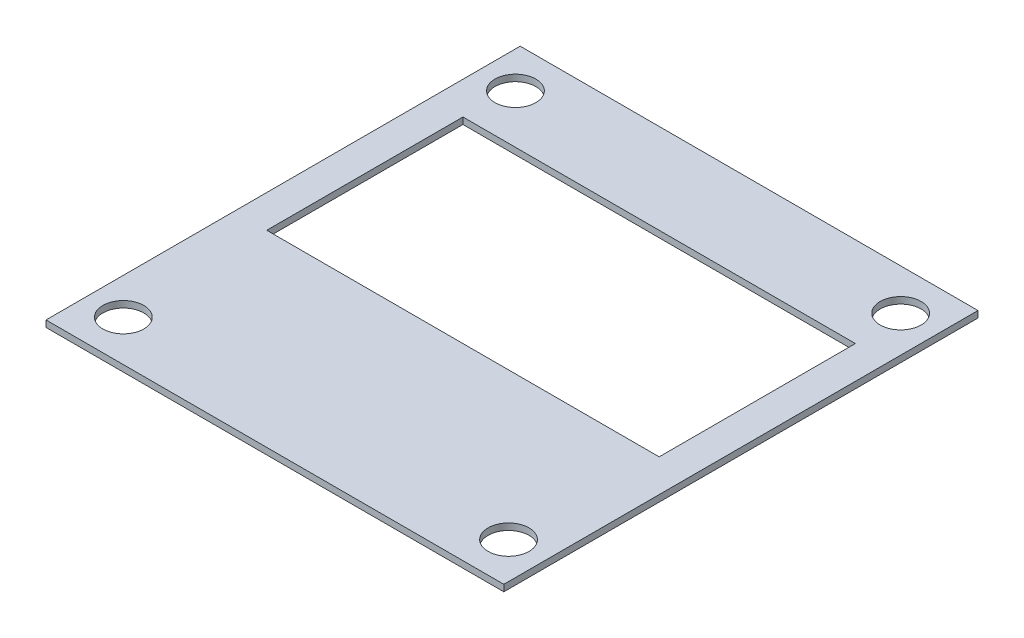
ISO-10303-21;
HEADER;
FILE_DESCRIPTION(('STEP AP214'),'2;1');
FILE_NAME('part.step','',(''),(''),'','','');
FILE_SCHEMA(('AUTOMOTIVE_DESIGN { 1 0 10303 214 1 1 1 1 }'));
ENDSEC;
DATA;
#1=APPLICATION_CONTEXT('core data for automotive mechanical design processes');
#2=APPLICATION_PROTOCOL_DEFINITION('international standard','automotive_design',2000,#1);
#3=PRODUCT_CONTEXT('',#1,'mechanical');
#4=PRODUCT('Part','Part','',(#3));
#5=PRODUCT_RELATED_PRODUCT_CATEGORY('part','',(#4));
#6=PRODUCT_DEFINITION_FORMATION('','',#4);
#7=PRODUCT_DEFINITION_CONTEXT('part definition',#1,'design');
#8=PRODUCT_DEFINITION('design','',#6,#7);
#9=PRODUCT_DEFINITION_SHAPE('','',#8);
#10=(LENGTH_UNIT() NAMED_UNIT(*) SI_UNIT(.MILLI.,.METRE.));
#11=(NAMED_UNIT(*) PLANE_ANGLE_UNIT() SI_UNIT($,.RADIAN.));
#12=(NAMED_UNIT(*) SI_UNIT($,.STERADIAN.) SOLID_ANGLE_UNIT());
#13=UNCERTAINTY_MEASURE_WITH_UNIT(LENGTH_MEASURE(1.E-05),#10,'distance_accuracy_value','');
#14=(GEOMETRIC_REPRESENTATION_CONTEXT(3) GLOBAL_UNCERTAINTY_ASSIGNED_CONTEXT((#13)) GLOBAL_UNIT_ASSIGNED_CONTEXT((#10,
#11,#12)) REPRESENTATION_CONTEXT('',''));
#15=CARTESIAN_POINT('',(0.,0.,0.));
#16=DIRECTION('',(0.,0.,1.));
#17=DIRECTION('',(1.,0.,0.));
#18=AXIS2_PLACEMENT_3D('',#15,#16,#17);
#19=CARTESIAN_POINT('',(0.,0.4,0.));
#20=DIRECTION('',(0.,1.,0.));
#21=DIRECTION('',(0.,0.,1.));
#22=AXIS2_PLACEMENT_3D('',#19,#20,#21);
#23=PLANE('',#22);
#24=CARTESIAN_POINT('',(11.78,0.399999999999999,11.99));
#25=DIRECTION('',(0.,1.,0.));
#26=DIRECTION('',(0.,0.,1.));
#27=AXIS2_PLACEMENT_3D('',#24,#25,#26);
#28=CIRCLE('',#27,1.25);
#29=CARTESIAN_POINT('',(11.78,0.399999999999999,13.24));
#30=VERTEX_POINT('',#29);
#31=EDGE_CURVE('E143',#30,#30,#28,.T.);
#32=ORIENTED_EDGE('',*,*,#31,.F.);
#33=EDGE_LOOP('',(#32));
#34=FACE_BOUND('',#33,.T.);
#35=CARTESIAN_POINT('',(-11.78,0.399999999999999,11.99));
#36=DIRECTION('',(0.,1.,0.));
#37=DIRECTION('',(0.,0.,1.));
#38=AXIS2_PLACEMENT_3D('',#35,#36,#37);
#39=CIRCLE('',#38,1.25);
#40=CARTESIAN_POINT('',(-11.78,0.399999999999999,13.24));
#41=VERTEX_POINT('',#40);
#42=EDGE_CURVE('E296',#41,#41,#39,.T.);
#43=ORIENTED_EDGE('',*,*,#42,.F.);
#44=EDGE_LOOP('',(#43));
#45=FACE_BOUND('',#44,.T.);
#46=CARTESIAN_POINT('',(-11.78,0.399999999999999,-11.99));
#47=DIRECTION('',(0.,1.,0.));
#48=DIRECTION('',(0.,0.,1.));
#49=AXIS2_PLACEMENT_3D('',#46,#47,#48);
#50=CIRCLE('',#49,1.25);
#51=CARTESIAN_POINT('',(-11.78,0.399999999999999,-10.74));
#52=VERTEX_POINT('',#51);
#53=EDGE_CURVE('E270',#52,#52,#50,.T.);
#54=ORIENTED_EDGE('',*,*,#53,.F.);
#55=EDGE_LOOP('',(#54));
#56=FACE_BOUND('',#55,.T.);
#57=CARTESIAN_POINT('',(11.78,0.399999999999999,-11.99));
#58=DIRECTION('',(0.,1.,0.));
#59=DIRECTION('',(0.,0.,1.));
#60=AXIS2_PLACEMENT_3D('',#57,#58,#59);
#61=CIRCLE('',#60,1.25);
#62=CARTESIAN_POINT('',(11.78,0.399999999999999,-10.74));
#63=VERTEX_POINT('',#62);
#64=EDGE_CURVE('E282',#63,#63,#61,.T.);
#65=ORIENTED_EDGE('',*,*,#64,.F.);
#66=EDGE_LOOP('',(#65));
#67=FACE_BOUND('',#66,.T.);
#68=DIRECTION('',(0.,0.,-1.));
#69=VECTOR('',#68,1.);
#70=CARTESIAN_POINT('',(14.,0.4,-14.5));
#71=LINE('',#70,#69);
#72=CARTESIAN_POINT('',(14.,0.4,14.5));
#73=VERTEX_POINT('',#72);
#74=CARTESIAN_POINT('',(14.,0.4,-14.5));
#75=VERTEX_POINT('',#74);
#76=EDGE_CURVE('E159',#73,#75,#71,.T.);
#77=ORIENTED_EDGE('',*,*,#76,.T.);
#78=DIRECTION('',(-1.,0.,0.));
#79=VECTOR('',#78,1.);
#80=CARTESIAN_POINT('',(-14.,0.4,-14.5));
#81=LINE('',#80,#79);
#82=CARTESIAN_POINT('',(-14.,0.4,-14.5));
#83=VERTEX_POINT('',#82);
#84=EDGE_CURVE('E163',#75,#83,#81,.T.);
#85=ORIENTED_EDGE('',*,*,#84,.T.);
#86=DIRECTION('',(0.,0.,1.));
#87=VECTOR('',#86,1.);
#88=CARTESIAN_POINT('',(-14.,0.4,-14.5));
#89=LINE('',#88,#87);
#90=CARTESIAN_POINT('',(-14.,0.4,14.5));
#91=VERTEX_POINT('',#90);
#92=EDGE_CURVE('E167',#83,#91,#89,.T.);
#93=ORIENTED_EDGE('',*,*,#92,.T.);
#94=DIRECTION('',(1.,0.,0.));
#95=VECTOR('',#94,1.);
#96=CARTESIAN_POINT('',(-14.,0.4,14.5));
#97=LINE('',#96,#95);
#98=EDGE_CURVE('E170',#91,#73,#97,.T.);
#99=ORIENTED_EDGE('',*,*,#98,.T.);
#100=EDGE_LOOP('',(#77,#85,#93,#99));
#101=FACE_BOUND('',#100,.T.);
#102=DIRECTION('',(-1.,0.,0.));
#103=VECTOR('',#102,1.);
#104=CARTESIAN_POINT('',(-12.,0.4,-9.));
#105=LINE('',#104,#103);
#106=CARTESIAN_POINT('',(12.,0.4,-9.));
#107=VERTEX_POINT('',#106);
#108=CARTESIAN_POINT('',(-12.,0.4,-9.));
#109=VERTEX_POINT('',#108);
#110=EDGE_CURVE('E118',#107,#109,#105,.T.);
#111=ORIENTED_EDGE('',*,*,#110,.F.);
#112=DIRECTION('',(0.,0.,-1.));
#113=VECTOR('',#112,1.);
#114=CARTESIAN_POINT('',(12.,0.4,-9.));
#115=LINE('',#114,#113);
#116=CARTESIAN_POINT('',(12.,0.4,3.));
#117=VERTEX_POINT('',#116);
#118=EDGE_CURVE('E109',#117,#107,#115,.T.);
#119=ORIENTED_EDGE('',*,*,#118,.F.);
#120=DIRECTION('',(1.,0.,0.));
#121=VECTOR('',#120,1.);
#122=CARTESIAN_POINT('',(-12.,0.4,3.));
#123=LINE('',#122,#121);
#124=CARTESIAN_POINT('',(-12.,0.4,3.));
#125=VERTEX_POINT('',#124);
#126=EDGE_CURVE('E135',#125,#117,#123,.T.);
#127=ORIENTED_EDGE('',*,*,#126,.F.);
#128=DIRECTION('',(0.,0.,1.));
#129=VECTOR('',#128,1.);
#130=CARTESIAN_POINT('',(-12.,0.4,-9.));
#131=LINE('',#130,#129);
#132=EDGE_CURVE('E131',#109,#125,#131,.T.);
#133=ORIENTED_EDGE('',*,*,#132,.F.);
#134=EDGE_LOOP('',(#111,#119,#127,#133));
#135=FACE_BOUND('',#134,.T.);
#136=ADVANCED_FACE('F43',(#34,#45,#56,#67,#101,#135),#23,.T.);
#137=CARTESIAN_POINT('',(0.,0.,0.));
#138=DIRECTION('',(0.,1.,0.));
#139=DIRECTION('',(0.,0.,1.));
#140=AXIS2_PLACEMENT_3D('',#137,#138,#139);
#141=PLANE('',#140);
#142=CARTESIAN_POINT('',(11.78,0.,11.99));
#143=DIRECTION('',(0.,-1.,0.));
#144=DIRECTION('',(0.,0.,-1.));
#145=AXIS2_PLACEMENT_3D('',#142,#143,#144);
#146=CIRCLE('',#145,1.25);
#147=CARTESIAN_POINT('',(11.78,0.,10.74));
#148=VERTEX_POINT('',#147);
#149=EDGE_CURVE('E285',#148,#148,#146,.T.);
#150=ORIENTED_EDGE('',*,*,#149,.F.);
#151=EDGE_LOOP('',(#150));
#152=FACE_BOUND('',#151,.T.);
#153=CARTESIAN_POINT('',(-11.78,0.,11.99));
#154=DIRECTION('',(0.,-1.,0.));
#155=DIRECTION('',(0.,0.,-1.));
#156=AXIS2_PLACEMENT_3D('',#153,#154,#155);
#157=CIRCLE('',#156,1.25);
#158=CARTESIAN_POINT('',(-11.78,0.,10.74));
#159=VERTEX_POINT('',#158);
#160=EDGE_CURVE('E277',#159,#159,#157,.T.);
#161=ORIENTED_EDGE('',*,*,#160,.F.);
#162=EDGE_LOOP('',(#161));
#163=FACE_BOUND('',#162,.T.);
#164=CARTESIAN_POINT('',(-11.78,0.,-11.99));
#165=DIRECTION('',(0.,-1.,0.));
#166=DIRECTION('',(0.,0.,-1.));
#167=AXIS2_PLACEMENT_3D('',#164,#165,#166);
#168=CIRCLE('',#167,1.25);
#169=CARTESIAN_POINT('',(-11.78,0.,-13.24));
#170=VERTEX_POINT('',#169);
#171=EDGE_CURVE('E273',#170,#170,#168,.T.);
#172=ORIENTED_EDGE('',*,*,#171,.F.);
#173=EDGE_LOOP('',(#172));
#174=FACE_BOUND('',#173,.T.);
#175=CARTESIAN_POINT('',(11.78,0.,-11.99));
#176=DIRECTION('',(0.,-1.,0.));
#177=DIRECTION('',(0.,0.,-1.));
#178=AXIS2_PLACEMENT_3D('',#175,#176,#177);
#179=CIRCLE('',#178,1.25);
#180=CARTESIAN_POINT('',(11.78,0.,-13.24));
#181=VERTEX_POINT('',#180);
#182=EDGE_CURVE('E276',#181,#181,#179,.T.);
#183=ORIENTED_EDGE('',*,*,#182,.F.);
#184=EDGE_LOOP('',(#183));
#185=FACE_BOUND('',#184,.T.);
#186=DIRECTION('',(0.,0.,-1.));
#187=VECTOR('',#186,1.);
#188=CARTESIAN_POINT('',(14.,0.,-14.5));
#189=LINE('',#188,#187);
#190=CARTESIAN_POINT('',(14.,0.,14.5));
#191=VERTEX_POINT('',#190);
#192=CARTESIAN_POINT('',(14.,0.,-14.5));
#193=VERTEX_POINT('',#192);
#194=EDGE_CURVE('E127',#191,#193,#189,.T.);
#195=ORIENTED_EDGE('',*,*,#194,.F.);
#196=DIRECTION('',(1.,0.,0.));
#197=VECTOR('',#196,1.);
#198=CARTESIAN_POINT('',(-14.,0.,14.5));
#199=LINE('',#198,#197);
#200=CARTESIAN_POINT('',(-14.,0.,14.5));
#201=VERTEX_POINT('',#200);
#202=EDGE_CURVE('E164',#201,#191,#199,.T.);
#203=ORIENTED_EDGE('',*,*,#202,.F.);
#204=DIRECTION('',(0.,0.,1.));
#205=VECTOR('',#204,1.);
#206=CARTESIAN_POINT('',(-14.,0.,-14.5));
#207=LINE('',#206,#205);
#208=CARTESIAN_POINT('',(-14.,0.,-14.5));
#209=VERTEX_POINT('',#208);
#210=EDGE_CURVE('E180',#209,#201,#207,.T.);
#211=ORIENTED_EDGE('',*,*,#210,.F.);
#212=DIRECTION('',(-1.,0.,0.));
#213=VECTOR('',#212,1.);
#214=CARTESIAN_POINT('',(-14.,0.,-14.5));
#215=LINE('',#214,#213);
#216=EDGE_CURVE('E177',#193,#209,#215,.T.);
#217=ORIENTED_EDGE('',*,*,#216,.F.);
#218=EDGE_LOOP('',(#195,#203,#211,#217));
#219=FACE_BOUND('',#218,.T.);
#220=DIRECTION('',(0.,0.,-1.));
#221=VECTOR('',#220,1.);
#222=CARTESIAN_POINT('',(12.,0.,-9.));
#223=LINE('',#222,#221);
#224=CARTESIAN_POINT('',(12.,0.,3.));
#225=VERTEX_POINT('',#224);
#226=CARTESIAN_POINT('',(12.,0.,-9.));
#227=VERTEX_POINT('',#226);
#228=EDGE_CURVE('E67',#225,#227,#223,.T.);
#229=ORIENTED_EDGE('',*,*,#228,.T.);
#230=DIRECTION('',(-1.,0.,0.));
#231=VECTOR('',#230,1.);
#232=CARTESIAN_POINT('',(-12.,0.,-9.));
#233=LINE('',#232,#231);
#234=CARTESIAN_POINT('',(-12.,0.,-9.));
#235=VERTEX_POINT('',#234);
#236=EDGE_CURVE('E125',#227,#235,#233,.T.);
#237=ORIENTED_EDGE('',*,*,#236,.T.);
#238=DIRECTION('',(0.,0.,1.));
#239=VECTOR('',#238,1.);
#240=CARTESIAN_POINT('',(-12.,0.,-9.));
#241=LINE('',#240,#239);
#242=CARTESIAN_POINT('',(-12.,0.,3.));
#243=VERTEX_POINT('',#242);
#244=EDGE_CURVE('E146',#235,#243,#241,.T.);
#245=ORIENTED_EDGE('',*,*,#244,.T.);
#246=DIRECTION('',(1.,0.,0.));
#247=VECTOR('',#246,1.);
#248=CARTESIAN_POINT('',(-12.,0.,3.));
#249=LINE('',#248,#247);
#250=EDGE_CURVE('E119',#243,#225,#249,.T.);
#251=ORIENTED_EDGE('',*,*,#250,.T.);
#252=EDGE_LOOP('',(#229,#237,#245,#251));
#253=FACE_BOUND('',#252,.T.);
#254=ADVANCED_FACE('F203',(#152,#163,#174,#185,#219,#253),#141,.F.);
#255=CARTESIAN_POINT('',(14.,0.4,-14.5));
#256=DIRECTION('',(-1.,0.,0.));
#257=DIRECTION('',(0.,0.,1.));
#258=AXIS2_PLACEMENT_3D('',#255,#256,#257);
#259=PLANE('',#258);
#260=ORIENTED_EDGE('',*,*,#194,.T.);
#261=DIRECTION('',(0.,-1.,0.));
#262=VECTOR('',#261,1.);
#263=CARTESIAN_POINT('',(14.,0.4,-14.5));
#264=LINE('',#263,#262);
#265=EDGE_CURVE('E11',#75,#193,#264,.T.);
#266=ORIENTED_EDGE('',*,*,#265,.F.);
#267=ORIENTED_EDGE('',*,*,#76,.F.);
#268=DIRECTION('',(0.,-1.,0.));
#269=VECTOR('',#268,1.);
#270=CARTESIAN_POINT('',(14.,0.4,14.5));
#271=LINE('',#270,#269);
#272=EDGE_CURVE('E173',#73,#191,#271,.T.);
#273=ORIENTED_EDGE('',*,*,#272,.T.);
#274=EDGE_LOOP('',(#260,#266,#267,#273));
#275=FACE_BOUND('',#274,.T.);
#276=ADVANCED_FACE('F45',(#275),#259,.F.);
#277=CARTESIAN_POINT('',(-14.,0.4,-14.5));
#278=DIRECTION('',(0.,0.,1.));
#279=DIRECTION('',(1.,0.,0.));
#280=AXIS2_PLACEMENT_3D('',#277,#278,#279);
#281=PLANE('',#280);
#282=ORIENTED_EDGE('',*,*,#216,.T.);
#283=DIRECTION('',(0.,-1.,0.));
#284=VECTOR('',#283,1.);
#285=CARTESIAN_POINT('',(-14.,0.4,-14.5));
#286=LINE('',#285,#284);
#287=EDGE_CURVE('E52',#83,#209,#286,.T.);
#288=ORIENTED_EDGE('',*,*,#287,.F.);
#289=ORIENTED_EDGE('',*,*,#84,.F.);
#290=ORIENTED_EDGE('',*,*,#265,.T.);
#291=EDGE_LOOP('',(#282,#288,#289,#290));
#292=FACE_BOUND('',#291,.T.);
#293=ADVANCED_FACE('F213',(#292),#281,.F.);
#294=CARTESIAN_POINT('',(-14.,0.4,-14.5));
#295=DIRECTION('',(1.,0.,0.));
#296=DIRECTION('',(0.,0.,-1.));
#297=AXIS2_PLACEMENT_3D('',#294,#295,#296);
#298=PLANE('',#297);
#299=ORIENTED_EDGE('',*,*,#210,.T.);
#300=DIRECTION('',(0.,-1.,0.));
#301=VECTOR('',#300,1.);
#302=CARTESIAN_POINT('',(-14.,0.4,14.5));
#303=LINE('',#302,#301);
#304=EDGE_CURVE('E188',#91,#201,#303,.T.);
#305=ORIENTED_EDGE('',*,*,#304,.F.);
#306=ORIENTED_EDGE('',*,*,#92,.F.);
#307=ORIENTED_EDGE('',*,*,#287,.T.);
#308=EDGE_LOOP('',(#299,#305,#306,#307));
#309=FACE_BOUND('',#308,.T.);
#310=ADVANCED_FACE('F197',(#309),#298,.F.);
#311=CARTESIAN_POINT('',(-14.,0.4,14.5));
#312=DIRECTION('',(0.,0.,-1.));
#313=DIRECTION('',(-1.,0.,0.));
#314=AXIS2_PLACEMENT_3D('',#311,#312,#313);
#315=PLANE('',#314);
#316=ORIENTED_EDGE('',*,*,#202,.T.);
#317=ORIENTED_EDGE('',*,*,#272,.F.);
#318=ORIENTED_EDGE('',*,*,#98,.F.);
#319=ORIENTED_EDGE('',*,*,#304,.T.);
#320=EDGE_LOOP('',(#316,#317,#318,#319));
#321=FACE_BOUND('',#320,.T.);
#322=ADVANCED_FACE('F207',(#321),#315,.F.);
#323=CARTESIAN_POINT('',(12.,0.4,-9.));
#324=DIRECTION('',(-1.,0.,0.));
#325=DIRECTION('',(0.,0.,1.));
#326=AXIS2_PLACEMENT_3D('',#323,#324,#325);
#327=PLANE('',#326);
#328=ORIENTED_EDGE('',*,*,#228,.F.);
#329=DIRECTION('',(0.,-1.,0.));
#330=VECTOR('',#329,1.);
#331=CARTESIAN_POINT('',(12.,0.4,3.));
#332=LINE('',#331,#330);
#333=EDGE_CURVE('E113',#117,#225,#332,.T.);
#334=ORIENTED_EDGE('',*,*,#333,.F.);
#335=ORIENTED_EDGE('',*,*,#118,.T.);
#336=DIRECTION('',(0.,-1.,0.));
#337=VECTOR('',#336,1.);
#338=CARTESIAN_POINT('',(12.,0.4,-9.));
#339=LINE('',#338,#337);
#340=EDGE_CURVE('E112',#107,#227,#339,.T.);
#341=ORIENTED_EDGE('',*,*,#340,.T.);
#342=EDGE_LOOP('',(#328,#334,#335,#341));
#343=FACE_BOUND('',#342,.T.);
#344=ADVANCED_FACE('F111',(#343),#327,.T.);
#345=CARTESIAN_POINT('',(-12.,0.4,-9.));
#346=DIRECTION('',(0.,0.,1.));
#347=DIRECTION('',(1.,0.,0.));
#348=AXIS2_PLACEMENT_3D('',#345,#346,#347);
#349=PLANE('',#348);
#350=ORIENTED_EDGE('',*,*,#236,.F.);
#351=ORIENTED_EDGE('',*,*,#340,.F.);
#352=ORIENTED_EDGE('',*,*,#110,.T.);
#353=DIRECTION('',(0.,-1.,0.));
#354=VECTOR('',#353,1.);
#355=CARTESIAN_POINT('',(-12.,0.4,-9.));
#356=LINE('',#355,#354);
#357=EDGE_CURVE('E128',#109,#235,#356,.T.);
#358=ORIENTED_EDGE('',*,*,#357,.T.);
#359=EDGE_LOOP('',(#350,#351,#352,#358));
#360=FACE_BOUND('',#359,.T.);
#361=ADVANCED_FACE('F122',(#360),#349,.T.);
#362=CARTESIAN_POINT('',(-12.,0.4,-9.));
#363=DIRECTION('',(1.,0.,0.));
#364=DIRECTION('',(0.,0.,-1.));
#365=AXIS2_PLACEMENT_3D('',#362,#363,#364);
#366=PLANE('',#365);
#367=ORIENTED_EDGE('',*,*,#244,.F.);
#368=ORIENTED_EDGE('',*,*,#357,.F.);
#369=ORIENTED_EDGE('',*,*,#132,.T.);
#370=DIRECTION('',(0.,-1.,0.));
#371=VECTOR('',#370,1.);
#372=CARTESIAN_POINT('',(-12.,0.4,3.));
#373=LINE('',#372,#371);
#374=EDGE_CURVE('E59',#125,#243,#373,.T.);
#375=ORIENTED_EDGE('',*,*,#374,.T.);
#376=EDGE_LOOP('',(#367,#368,#369,#375));
#377=FACE_BOUND('',#376,.T.);
#378=ADVANCED_FACE('F240',(#377),#366,.T.);
#379=CARTESIAN_POINT('',(-12.,0.4,3.));
#380=DIRECTION('',(0.,0.,-1.));
#381=DIRECTION('',(-1.,0.,0.));
#382=AXIS2_PLACEMENT_3D('',#379,#380,#381);
#383=PLANE('',#382);
#384=ORIENTED_EDGE('',*,*,#250,.F.);
#385=ORIENTED_EDGE('',*,*,#374,.F.);
#386=ORIENTED_EDGE('',*,*,#126,.T.);
#387=ORIENTED_EDGE('',*,*,#333,.T.);
#388=EDGE_LOOP('',(#384,#385,#386,#387));
#389=FACE_BOUND('',#388,.T.);
#390=ADVANCED_FACE('F244',(#389),#383,.T.);
#391=CARTESIAN_POINT('',(11.78,10.,-11.99));
#392=DIRECTION('',(0.,-1.,0.));
#393=DIRECTION('',(0.,0.,-1.));
#394=AXIS2_PLACEMENT_3D('',#391,#392,#393);
#395=CYLINDRICAL_SURFACE('',#394,1.25);
#396=ORIENTED_EDGE('',*,*,#64,.T.);
#397=EDGE_LOOP('',(#396));
#398=FACE_BOUND('',#397,.T.);
#399=ORIENTED_EDGE('',*,*,#182,.T.);
#400=EDGE_LOOP('',(#399));
#401=FACE_BOUND('',#400,.T.);
#402=ADVANCED_FACE('F250',(#398,#401),#395,.F.);
#403=CARTESIAN_POINT('',(-11.78,10.,-11.99));
#404=DIRECTION('',(0.,-1.,0.));
#405=DIRECTION('',(0.,0.,-1.));
#406=AXIS2_PLACEMENT_3D('',#403,#404,#405);
#407=CYLINDRICAL_SURFACE('',#406,1.25);
#408=ORIENTED_EDGE('',*,*,#53,.T.);
#409=EDGE_LOOP('',(#408));
#410=FACE_BOUND('',#409,.T.);
#411=ORIENTED_EDGE('',*,*,#171,.T.);
#412=EDGE_LOOP('',(#411));
#413=FACE_BOUND('',#412,.T.);
#414=ADVANCED_FACE('F253',(#410,#413),#407,.F.);
#415=CARTESIAN_POINT('',(-11.78,10.,11.99));
#416=DIRECTION('',(0.,-1.,0.));
#417=DIRECTION('',(0.,0.,-1.));
#418=AXIS2_PLACEMENT_3D('',#415,#416,#417);
#419=CYLINDRICAL_SURFACE('',#418,1.25);
#420=ORIENTED_EDGE('',*,*,#42,.T.);
#421=EDGE_LOOP('',(#420));
#422=FACE_BOUND('',#421,.T.);
#423=ORIENTED_EDGE('',*,*,#160,.T.);
#424=EDGE_LOOP('',(#423));
#425=FACE_BOUND('',#424,.T.);
#426=ADVANCED_FACE('F258',(#422,#425),#419,.F.);
#427=CARTESIAN_POINT('',(11.78,10.,11.99));
#428=DIRECTION('',(0.,-1.,0.));
#429=DIRECTION('',(0.,0.,-1.));
#430=AXIS2_PLACEMENT_3D('',#427,#428,#429);
#431=CYLINDRICAL_SURFACE('',#430,1.25);
#432=ORIENTED_EDGE('',*,*,#31,.T.);
#433=EDGE_LOOP('',(#432));
#434=FACE_BOUND('',#433,.T.);
#435=ORIENTED_EDGE('',*,*,#149,.T.);
#436=EDGE_LOOP('',(#435));
#437=FACE_BOUND('',#436,.T.);
#438=ADVANCED_FACE('F255',(#434,#437),#431,.F.);
#439=CLOSED_SHELL('',(#136,#254,#276,#293,#310,#322,#344,#361,#378,#390,#402,#414,#426,#438));
#440=MANIFOLD_SOLID_BREP('B2',#439);
#441=ADVANCED_BREP_SHAPE_REPRESENTATION('',(#18,#440),#14);
#442=SHAPE_DEFINITION_REPRESENTATION(#9,#441);
ENDSEC;
END-ISO-10303-21;
